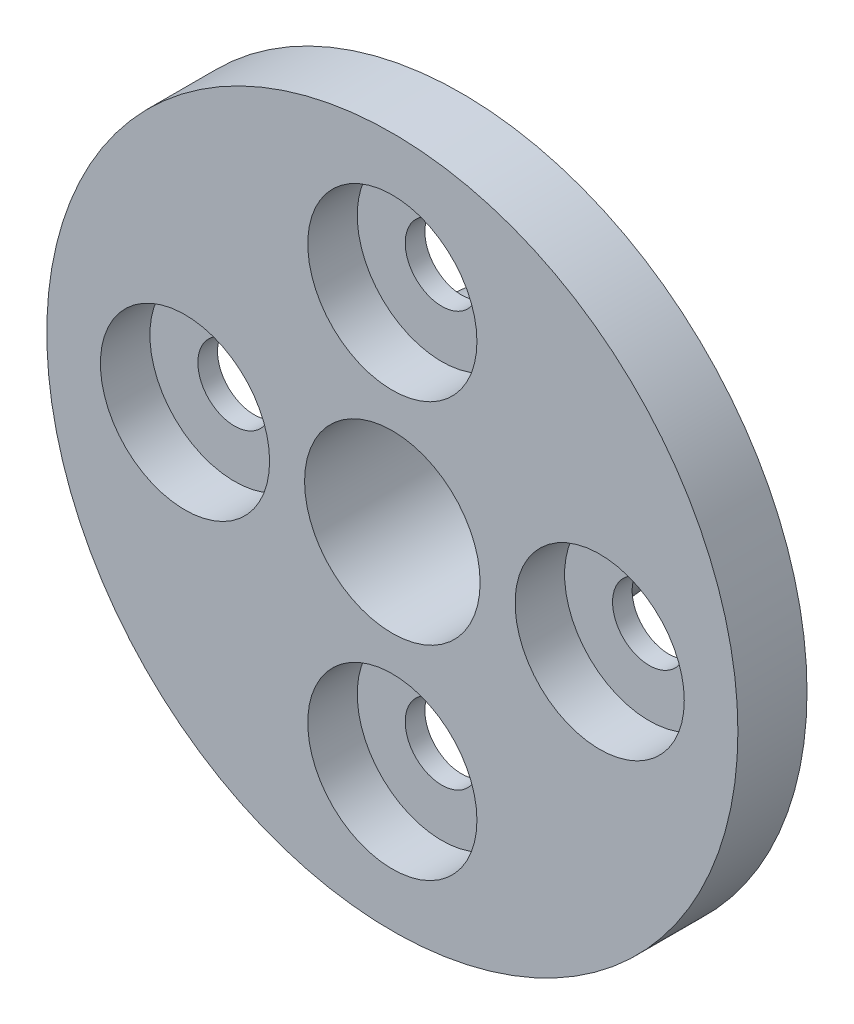
ISO-10303-21;
HEADER;
FILE_DESCRIPTION(('STEP AP214'),'2;1');
FILE_NAME('part.step','',(''),(''),'','','');
FILE_SCHEMA(('AUTOMOTIVE_DESIGN { 1 0 10303 214 1 1 1 1 }'));
ENDSEC;
DATA;
#1=APPLICATION_CONTEXT('core data for automotive mechanical design processes');
#2=APPLICATION_PROTOCOL_DEFINITION('international standard','automotive_design',2000,#1);
#3=PRODUCT_CONTEXT('',#1,'mechanical');
#4=PRODUCT('Part','Part','',(#3));
#5=PRODUCT_RELATED_PRODUCT_CATEGORY('part','',(#4));
#6=PRODUCT_DEFINITION_FORMATION('','',#4);
#7=PRODUCT_DEFINITION_CONTEXT('part definition',#1,'design');
#8=PRODUCT_DEFINITION('design','',#6,#7);
#9=PRODUCT_DEFINITION_SHAPE('','',#8);
#10=(LENGTH_UNIT() NAMED_UNIT(*) SI_UNIT(.MILLI.,.METRE.));
#11=(NAMED_UNIT(*) PLANE_ANGLE_UNIT() SI_UNIT($,.RADIAN.));
#12=(NAMED_UNIT(*) SI_UNIT($,.STERADIAN.) SOLID_ANGLE_UNIT());
#13=UNCERTAINTY_MEASURE_WITH_UNIT(LENGTH_MEASURE(1.E-05),#10,'distance_accuracy_value','');
#14=(GEOMETRIC_REPRESENTATION_CONTEXT(3) GLOBAL_UNCERTAINTY_ASSIGNED_CONTEXT((#13)) GLOBAL_UNIT_ASSIGNED_CONTEXT((#10,
#11,#12)) REPRESENTATION_CONTEXT('',''));
#15=CARTESIAN_POINT('',(0.,0.,0.));
#16=DIRECTION('',(0.,0.,1.));
#17=DIRECTION('',(1.,0.,0.));
#18=AXIS2_PLACEMENT_3D('',#15,#16,#17);
#19=CARTESIAN_POINT('',(0.,0.,0.));
#20=DIRECTION('',(0.,0.,1.));
#21=DIRECTION('',(1.,0.,0.));
#22=AXIS2_PLACEMENT_3D('',#19,#20,#21);
#23=PLANE('',#22);
#24=CARTESIAN_POINT('',(0.,15.,0.));
#25=DIRECTION('',(0.,0.,1.));
#26=DIRECTION('',(1.,0.,0.));
#27=AXIS2_PLACEMENT_3D('',#24,#25,#26);
#28=CIRCLE('',#27,2.65);
#29=CARTESIAN_POINT('',(2.65,15.,0.));
#30=VERTEX_POINT('',#29);
#31=EDGE_CURVE('E35',#30,#30,#28,.T.);
#32=ORIENTED_EDGE('',*,*,#31,.T.);
#33=EDGE_LOOP('',(#32));
#34=FACE_BOUND('',#33,.T.);
#35=CARTESIAN_POINT('',(15.,0.,0.));
#36=DIRECTION('',(0.,0.,1.));
#37=DIRECTION('',(1.,0.,0.));
#38=AXIS2_PLACEMENT_3D('',#35,#36,#37);
#39=CIRCLE('',#38,2.65);
#40=CARTESIAN_POINT('',(17.65,0.,0.));
#41=VERTEX_POINT('',#40);
#42=EDGE_CURVE('E57',#41,#41,#39,.T.);
#43=ORIENTED_EDGE('',*,*,#42,.T.);
#44=EDGE_LOOP('',(#43));
#45=FACE_BOUND('',#44,.T.);
#46=CARTESIAN_POINT('',(0.,-15.,0.));
#47=DIRECTION('',(0.,0.,1.));
#48=DIRECTION('',(1.,0.,0.));
#49=AXIS2_PLACEMENT_3D('',#46,#47,#48);
#50=CIRCLE('',#49,2.65);
#51=CARTESIAN_POINT('',(2.65,-15.,0.));
#52=VERTEX_POINT('',#51);
#53=EDGE_CURVE('E53',#52,#52,#50,.T.);
#54=ORIENTED_EDGE('',*,*,#53,.T.);
#55=EDGE_LOOP('',(#54));
#56=FACE_BOUND('',#55,.T.);
#57=CARTESIAN_POINT('',(-15.,0.,0.));
#58=DIRECTION('',(0.,0.,1.));
#59=DIRECTION('',(1.,0.,0.));
#60=AXIS2_PLACEMENT_3D('',#57,#58,#59);
#61=CIRCLE('',#60,2.65);
#62=CARTESIAN_POINT('',(-12.35,0.,0.));
#63=VERTEX_POINT('',#62);
#64=EDGE_CURVE('E48',#63,#63,#61,.T.);
#65=ORIENTED_EDGE('',*,*,#64,.T.);
#66=EDGE_LOOP('',(#65));
#67=FACE_BOUND('',#66,.T.);
#68=CARTESIAN_POINT('',(0.,0.,0.));
#69=DIRECTION('',(0.,0.,1.));
#70=DIRECTION('',(1.,0.,0.));
#71=AXIS2_PLACEMENT_3D('',#68,#69,#70);
#72=CIRCLE('',#71,25.);
#73=CARTESIAN_POINT('',(25.,0.,0.));
#74=VERTEX_POINT('',#73);
#75=EDGE_CURVE('E44',#74,#74,#72,.T.);
#76=ORIENTED_EDGE('',*,*,#75,.F.);
#77=EDGE_LOOP('',(#76));
#78=FACE_BOUND('',#77,.T.);
#79=CARTESIAN_POINT('',(0.,0.,0.));
#80=DIRECTION('',(0.,0.,1.));
#81=DIRECTION('',(1.,0.,0.));
#82=AXIS2_PLACEMENT_3D('',#79,#80,#81);
#83=CIRCLE('',#82,9.);
#84=CARTESIAN_POINT('',(9.,0.,0.));
#85=VERTEX_POINT('',#84);
#86=EDGE_CURVE('E10',#85,#85,#83,.F.);
#87=ORIENTED_EDGE('',*,*,#86,.F.);
#88=EDGE_LOOP('',(#87));
#89=FACE_BOUND('',#88,.T.);
#90=ADVANCED_FACE('F31',(#34,#45,#56,#67,#78,#89),#23,.F.);
#91=CARTESIAN_POINT('',(0.,0.,5.));
#92=DIRECTION('',(0.,0.,1.));
#93=DIRECTION('',(1.,0.,0.));
#94=AXIS2_PLACEMENT_3D('',#91,#92,#93);
#95=PLANE('',#94);
#96=CARTESIAN_POINT('',(0.,15.,5.));
#97=DIRECTION('',(0.,0.,1.));
#98=DIRECTION('',(1.,0.,0.));
#99=AXIS2_PLACEMENT_3D('',#96,#97,#98);
#100=CIRCLE('',#99,6.12);
#101=CARTESIAN_POINT('',(6.12,15.,5.));
#102=VERTEX_POINT('',#101);
#103=EDGE_CURVE('E176',#102,#102,#100,.T.);
#104=ORIENTED_EDGE('',*,*,#103,.F.);
#105=EDGE_LOOP('',(#104));
#106=FACE_BOUND('',#105,.T.);
#107=CARTESIAN_POINT('',(15.,0.,5.));
#108=DIRECTION('',(0.,0.,1.));
#109=DIRECTION('',(1.,0.,0.));
#110=AXIS2_PLACEMENT_3D('',#107,#108,#109);
#111=CIRCLE('',#110,6.12);
#112=CARTESIAN_POINT('',(21.12,0.,5.));
#113=VERTEX_POINT('',#112);
#114=EDGE_CURVE('E72',#113,#113,#111,.T.);
#115=ORIENTED_EDGE('',*,*,#114,.F.);
#116=EDGE_LOOP('',(#115));
#117=FACE_BOUND('',#116,.T.);
#118=CARTESIAN_POINT('',(0.,-15.,5.));
#119=DIRECTION('',(0.,0.,1.));
#120=DIRECTION('',(1.,0.,0.));
#121=AXIS2_PLACEMENT_3D('',#118,#119,#120);
#122=CIRCLE('',#121,6.12);
#123=CARTESIAN_POINT('',(6.12,-15.,5.));
#124=VERTEX_POINT('',#123);
#125=EDGE_CURVE('E59',#124,#124,#122,.T.);
#126=ORIENTED_EDGE('',*,*,#125,.F.);
#127=EDGE_LOOP('',(#126));
#128=FACE_BOUND('',#127,.T.);
#129=CARTESIAN_POINT('',(-15.,0.,5.));
#130=DIRECTION('',(0.,0.,1.));
#131=DIRECTION('',(1.,0.,0.));
#132=AXIS2_PLACEMENT_3D('',#129,#130,#131);
#133=CIRCLE('',#132,6.12);
#134=CARTESIAN_POINT('',(-8.88,0.,5.));
#135=VERTEX_POINT('',#134);
#136=EDGE_CURVE('E55',#135,#135,#133,.T.);
#137=ORIENTED_EDGE('',*,*,#136,.F.);
#138=EDGE_LOOP('',(#137));
#139=FACE_BOUND('',#138,.T.);
#140=CARTESIAN_POINT('',(0.,0.,5.));
#141=DIRECTION('',(0.,0.,1.));
#142=DIRECTION('',(1.,0.,0.));
#143=AXIS2_PLACEMENT_3D('',#140,#141,#142);
#144=CIRCLE('',#143,25.);
#145=CARTESIAN_POINT('',(25.,0.,5.));
#146=VERTEX_POINT('',#145);
#147=EDGE_CURVE('E39',#146,#146,#144,.T.);
#148=ORIENTED_EDGE('',*,*,#147,.T.);
#149=EDGE_LOOP('',(#148));
#150=FACE_BOUND('',#149,.T.);
#151=CARTESIAN_POINT('',(0.,0.,5.));
#152=DIRECTION('',(0.,0.,1.));
#153=DIRECTION('',(1.,0.,0.));
#154=AXIS2_PLACEMENT_3D('',#151,#152,#153);
#155=CIRCLE('',#154,6.35);
#156=CARTESIAN_POINT('',(6.35,0.,5.));
#157=VERTEX_POINT('',#156);
#158=EDGE_CURVE('E92',#157,#157,#155,.T.);
#159=ORIENTED_EDGE('',*,*,#158,.F.);
#160=EDGE_LOOP('',(#159));
#161=FACE_BOUND('',#160,.T.);
#162=ADVANCED_FACE('F102',(#106,#117,#128,#139,#150,#161),#95,.T.);
#163=CARTESIAN_POINT('',(0.,0.,5.));
#164=DIRECTION('',(0.,0.,-1.));
#165=DIRECTION('',(-1.,0.,0.));
#166=AXIS2_PLACEMENT_3D('',#163,#164,#165);
#167=CYLINDRICAL_SURFACE('',#166,25.);
#168=ORIENTED_EDGE('',*,*,#147,.F.);
#169=EDGE_LOOP('',(#168));
#170=FACE_BOUND('',#169,.T.);
#171=ORIENTED_EDGE('',*,*,#75,.T.);
#172=EDGE_LOOP('',(#171));
#173=FACE_BOUND('',#172,.T.);
#174=ADVANCED_FACE('F33',(#170,#173),#167,.T.);
#175=CARTESIAN_POINT('',(0.,0.,5.));
#176=DIRECTION('',(0.,0.,-1.));
#177=DIRECTION('',(-1.,0.,0.));
#178=AXIS2_PLACEMENT_3D('',#175,#176,#177);
#179=CYLINDRICAL_SURFACE('',#178,6.35);
#180=ORIENTED_EDGE('',*,*,#158,.T.);
#181=EDGE_LOOP('',(#180));
#182=FACE_BOUND('',#181,.T.);
#183=CARTESIAN_POINT('',(0.,0.,-6.));
#184=DIRECTION('',(0.,0.,-1.));
#185=DIRECTION('',(-1.,0.,0.));
#186=AXIS2_PLACEMENT_3D('',#183,#184,#185);
#187=CIRCLE('',#186,6.35);
#188=CARTESIAN_POINT('',(-6.35,0.,-6.));
#189=VERTEX_POINT('',#188);
#190=EDGE_CURVE('E51',#189,#189,#187,.T.);
#191=ORIENTED_EDGE('',*,*,#190,.T.);
#192=EDGE_LOOP('',(#191));
#193=FACE_BOUND('',#192,.T.);
#194=ADVANCED_FACE('F111',(#182,#193),#179,.F.);
#195=CARTESIAN_POINT('',(0.,0.,-6.));
#196=DIRECTION('',(0.,0.,-1.));
#197=DIRECTION('',(-1.,0.,0.));
#198=AXIS2_PLACEMENT_3D('',#195,#196,#197);
#199=PLANE('',#198);
#200=CARTESIAN_POINT('',(0.,0.,-6.));
#201=DIRECTION('',(0.,0.,-1.));
#202=DIRECTION('',(-1.,0.,0.));
#203=AXIS2_PLACEMENT_3D('',#200,#201,#202);
#204=CIRCLE('',#203,9.);
#205=CARTESIAN_POINT('',(-9.,0.,-6.));
#206=VERTEX_POINT('',#205);
#207=EDGE_CURVE('E89',#206,#206,#204,.T.);
#208=ORIENTED_EDGE('',*,*,#207,.T.);
#209=EDGE_LOOP('',(#208));
#210=FACE_BOUND('',#209,.T.);
#211=ORIENTED_EDGE('',*,*,#190,.F.);
#212=EDGE_LOOP('',(#211));
#213=FACE_BOUND('',#212,.T.);
#214=ADVANCED_FACE('F114',(#210,#213),#199,.T.);
#215=CARTESIAN_POINT('',(0.,0.,-6.));
#216=DIRECTION('',(0.,0.,1.));
#217=DIRECTION('',(1.,0.,0.));
#218=AXIS2_PLACEMENT_3D('',#215,#216,#217);
#219=CYLINDRICAL_SURFACE('',#218,9.);
#220=ORIENTED_EDGE('',*,*,#207,.F.);
#221=EDGE_LOOP('',(#220));
#222=FACE_BOUND('',#221,.T.);
#223=ORIENTED_EDGE('',*,*,#86,.T.);
#224=EDGE_LOOP('',(#223));
#225=FACE_BOUND('',#224,.T.);
#226=ADVANCED_FACE('F115',(#222,#225),#219,.T.);
#227=CARTESIAN_POINT('',(-15.,0.,5.));
#228=DIRECTION('',(0.,0.,1.));
#229=DIRECTION('',(1.,0.,0.));
#230=AXIS2_PLACEMENT_3D('',#227,#228,#229);
#231=CYLINDRICAL_SURFACE('',#230,2.65);
#232=CARTESIAN_POINT('',(-15.,0.,1.42));
#233=DIRECTION('',(0.,0.,1.));
#234=DIRECTION('',(1.,0.,0.));
#235=AXIS2_PLACEMENT_3D('',#232,#233,#234);
#236=CIRCLE('',#235,2.65);
#237=CARTESIAN_POINT('',(-12.35,0.,1.42));
#238=VERTEX_POINT('',#237);
#239=EDGE_CURVE('E52',#238,#238,#236,.T.);
#240=ORIENTED_EDGE('',*,*,#239,.T.);
#241=EDGE_LOOP('',(#240));
#242=FACE_BOUND('',#241,.T.);
#243=ORIENTED_EDGE('',*,*,#64,.F.);
#244=EDGE_LOOP('',(#243));
#245=FACE_BOUND('',#244,.T.);
#246=ADVANCED_FACE('F118',(#242,#245),#231,.F.);
#247=CARTESIAN_POINT('',(-12.35,0.,1.42));
#248=DIRECTION('',(0.,0.,-1.));
#249=DIRECTION('',(-1.,0.,0.));
#250=AXIS2_PLACEMENT_3D('',#247,#248,#249);
#251=PLANE('',#250);
#252=ORIENTED_EDGE('',*,*,#239,.F.);
#253=EDGE_LOOP('',(#252));
#254=FACE_BOUND('',#253,.T.);
#255=CARTESIAN_POINT('',(-15.,0.,1.42));
#256=DIRECTION('',(0.,0.,1.));
#257=DIRECTION('',(1.,0.,0.));
#258=AXIS2_PLACEMENT_3D('',#255,#256,#257);
#259=CIRCLE('',#258,6.12);
#260=CARTESIAN_POINT('',(-8.88,0.,1.42));
#261=VERTEX_POINT('',#260);
#262=EDGE_CURVE('E82',#261,#261,#259,.T.);
#263=ORIENTED_EDGE('',*,*,#262,.T.);
#264=EDGE_LOOP('',(#263));
#265=FACE_BOUND('',#264,.T.);
#266=ADVANCED_FACE('F125',(#254,#265),#251,.F.);
#267=CARTESIAN_POINT('',(-15.,0.,5.));
#268=DIRECTION('',(0.,0.,1.));
#269=DIRECTION('',(1.,0.,0.));
#270=AXIS2_PLACEMENT_3D('',#267,#268,#269);
#271=CYLINDRICAL_SURFACE('',#270,6.12);
#272=ORIENTED_EDGE('',*,*,#262,.F.);
#273=EDGE_LOOP('',(#272));
#274=FACE_BOUND('',#273,.T.);
#275=ORIENTED_EDGE('',*,*,#136,.T.);
#276=EDGE_LOOP('',(#275));
#277=FACE_BOUND('',#276,.T.);
#278=ADVANCED_FACE('F129',(#274,#277),#271,.F.);
#279=CARTESIAN_POINT('',(0.,-15.,5.));
#280=DIRECTION('',(0.,0.,1.));
#281=DIRECTION('',(1.,0.,0.));
#282=AXIS2_PLACEMENT_3D('',#279,#280,#281);
#283=CYLINDRICAL_SURFACE('',#282,2.65);
#284=CARTESIAN_POINT('',(0.,-15.,1.42));
#285=DIRECTION('',(0.,0.,1.));
#286=DIRECTION('',(1.,0.,0.));
#287=AXIS2_PLACEMENT_3D('',#284,#285,#286);
#288=CIRCLE('',#287,2.65);
#289=CARTESIAN_POINT('',(2.65,-15.,1.42));
#290=VERTEX_POINT('',#289);
#291=EDGE_CURVE('E56',#290,#290,#288,.T.);
#292=ORIENTED_EDGE('',*,*,#291,.T.);
#293=EDGE_LOOP('',(#292));
#294=FACE_BOUND('',#293,.T.);
#295=ORIENTED_EDGE('',*,*,#53,.F.);
#296=EDGE_LOOP('',(#295));
#297=FACE_BOUND('',#296,.T.);
#298=ADVANCED_FACE('F133',(#294,#297),#283,.F.);
#299=CARTESIAN_POINT('',(2.65,-15.,1.42));
#300=DIRECTION('',(0.,0.,-1.));
#301=DIRECTION('',(-1.,0.,0.));
#302=AXIS2_PLACEMENT_3D('',#299,#300,#301);
#303=PLANE('',#302);
#304=ORIENTED_EDGE('',*,*,#291,.F.);
#305=EDGE_LOOP('',(#304));
#306=FACE_BOUND('',#305,.T.);
#307=CARTESIAN_POINT('',(0.,-15.,1.42));
#308=DIRECTION('',(0.,0.,1.));
#309=DIRECTION('',(1.,0.,0.));
#310=AXIS2_PLACEMENT_3D('',#307,#308,#309);
#311=CIRCLE('',#310,6.12);
#312=CARTESIAN_POINT('',(6.12,-15.,1.42));
#313=VERTEX_POINT('',#312);
#314=EDGE_CURVE('E64',#313,#313,#311,.T.);
#315=ORIENTED_EDGE('',*,*,#314,.T.);
#316=EDGE_LOOP('',(#315));
#317=FACE_BOUND('',#316,.T.);
#318=ADVANCED_FACE('F137',(#306,#317),#303,.F.);
#319=CARTESIAN_POINT('',(0.,-15.,5.));
#320=DIRECTION('',(0.,0.,1.));
#321=DIRECTION('',(1.,0.,0.));
#322=AXIS2_PLACEMENT_3D('',#319,#320,#321);
#323=CYLINDRICAL_SURFACE('',#322,6.12);
#324=ORIENTED_EDGE('',*,*,#314,.F.);
#325=EDGE_LOOP('',(#324));
#326=FACE_BOUND('',#325,.T.);
#327=ORIENTED_EDGE('',*,*,#125,.T.);
#328=EDGE_LOOP('',(#327));
#329=FACE_BOUND('',#328,.T.);
#330=ADVANCED_FACE('F141',(#326,#329),#323,.F.);
#331=CARTESIAN_POINT('',(15.,0.,5.));
#332=DIRECTION('',(0.,0.,1.));
#333=DIRECTION('',(1.,0.,0.));
#334=AXIS2_PLACEMENT_3D('',#331,#332,#333);
#335=CYLINDRICAL_SURFACE('',#334,2.65);
#336=CARTESIAN_POINT('',(15.,0.,1.42));
#337=DIRECTION('',(0.,0.,1.));
#338=DIRECTION('',(1.,0.,0.));
#339=AXIS2_PLACEMENT_3D('',#336,#337,#338);
#340=CIRCLE('',#339,2.65);
#341=CARTESIAN_POINT('',(17.65,0.,1.42));
#342=VERTEX_POINT('',#341);
#343=EDGE_CURVE('E60',#342,#342,#340,.T.);
#344=ORIENTED_EDGE('',*,*,#343,.T.);
#345=EDGE_LOOP('',(#344));
#346=FACE_BOUND('',#345,.T.);
#347=ORIENTED_EDGE('',*,*,#42,.F.);
#348=EDGE_LOOP('',(#347));
#349=FACE_BOUND('',#348,.T.);
#350=ADVANCED_FACE('F145',(#346,#349),#335,.F.);
#351=CARTESIAN_POINT('',(17.65,0.,1.42));
#352=DIRECTION('',(0.,0.,-1.));
#353=DIRECTION('',(-1.,0.,0.));
#354=AXIS2_PLACEMENT_3D('',#351,#352,#353);
#355=PLANE('',#354);
#356=ORIENTED_EDGE('',*,*,#343,.F.);
#357=EDGE_LOOP('',(#356));
#358=FACE_BOUND('',#357,.T.);
#359=CARTESIAN_POINT('',(15.,0.,1.42));
#360=DIRECTION('',(0.,0.,1.));
#361=DIRECTION('',(1.,0.,0.));
#362=AXIS2_PLACEMENT_3D('',#359,#360,#361);
#363=CIRCLE('',#362,6.12);
#364=CARTESIAN_POINT('',(21.12,0.,1.42));
#365=VERTEX_POINT('',#364);
#366=EDGE_CURVE('E67',#365,#365,#363,.T.);
#367=ORIENTED_EDGE('',*,*,#366,.T.);
#368=EDGE_LOOP('',(#367));
#369=FACE_BOUND('',#368,.T.);
#370=ADVANCED_FACE('F149',(#358,#369),#355,.F.);
#371=CARTESIAN_POINT('',(15.,0.,5.));
#372=DIRECTION('',(0.,0.,1.));
#373=DIRECTION('',(1.,0.,0.));
#374=AXIS2_PLACEMENT_3D('',#371,#372,#373);
#375=CYLINDRICAL_SURFACE('',#374,6.12);
#376=ORIENTED_EDGE('',*,*,#366,.F.);
#377=EDGE_LOOP('',(#376));
#378=FACE_BOUND('',#377,.T.);
#379=ORIENTED_EDGE('',*,*,#114,.T.);
#380=EDGE_LOOP('',(#379));
#381=FACE_BOUND('',#380,.T.);
#382=ADVANCED_FACE('F152',(#378,#381),#375,.F.);
#383=CARTESIAN_POINT('',(0.,15.,5.));
#384=DIRECTION('',(0.,0.,1.));
#385=DIRECTION('',(1.,0.,0.));
#386=AXIS2_PLACEMENT_3D('',#383,#384,#385);
#387=CYLINDRICAL_SURFACE('',#386,2.65);
#388=CARTESIAN_POINT('',(0.,15.,1.42));
#389=DIRECTION('',(0.,0.,1.));
#390=DIRECTION('',(1.,0.,0.));
#391=AXIS2_PLACEMENT_3D('',#388,#389,#390);
#392=CIRCLE('',#391,2.65);
#393=CARTESIAN_POINT('',(2.65,15.,1.42));
#394=VERTEX_POINT('',#393);
#395=EDGE_CURVE('E178',#394,#394,#392,.T.);
#396=ORIENTED_EDGE('',*,*,#395,.T.);
#397=EDGE_LOOP('',(#396));
#398=FACE_BOUND('',#397,.T.);
#399=ORIENTED_EDGE('',*,*,#31,.F.);
#400=EDGE_LOOP('',(#399));
#401=FACE_BOUND('',#400,.T.);
#402=ADVANCED_FACE('F156',(#398,#401),#387,.F.);
#403=CARTESIAN_POINT('',(2.65,15.,1.42));
#404=DIRECTION('',(0.,0.,-1.));
#405=DIRECTION('',(-1.,0.,0.));
#406=AXIS2_PLACEMENT_3D('',#403,#404,#405);
#407=PLANE('',#406);
#408=ORIENTED_EDGE('',*,*,#395,.F.);
#409=EDGE_LOOP('',(#408));
#410=FACE_BOUND('',#409,.T.);
#411=CARTESIAN_POINT('',(0.,15.,1.42));
#412=DIRECTION('',(0.,0.,1.));
#413=DIRECTION('',(1.,0.,0.));
#414=AXIS2_PLACEMENT_3D('',#411,#412,#413);
#415=CIRCLE('',#414,6.12);
#416=CARTESIAN_POINT('',(6.12,15.,1.42));
#417=VERTEX_POINT('',#416);
#418=EDGE_CURVE('E173',#417,#417,#415,.T.);
#419=ORIENTED_EDGE('',*,*,#418,.T.);
#420=EDGE_LOOP('',(#419));
#421=FACE_BOUND('',#420,.T.);
#422=ADVANCED_FACE('F160',(#410,#421),#407,.F.);
#423=CARTESIAN_POINT('',(0.,15.,5.));
#424=DIRECTION('',(0.,0.,1.));
#425=DIRECTION('',(1.,0.,0.));
#426=AXIS2_PLACEMENT_3D('',#423,#424,#425);
#427=CYLINDRICAL_SURFACE('',#426,6.12);
#428=ORIENTED_EDGE('',*,*,#418,.F.);
#429=EDGE_LOOP('',(#428));
#430=FACE_BOUND('',#429,.T.);
#431=ORIENTED_EDGE('',*,*,#103,.T.);
#432=EDGE_LOOP('',(#431));
#433=FACE_BOUND('',#432,.T.);
#434=ADVANCED_FACE('F164',(#430,#433),#427,.F.);
#435=CLOSED_SHELL('',(#90,#162,#174,#194,#214,#226,#246,#266,#278,#298,#318,#330,#350,#370,#382,
#402,#422,#434));
#436=MANIFOLD_SOLID_BREP('B2',#435);
#437=ADVANCED_BREP_SHAPE_REPRESENTATION('',(#18,#436),#14);
#438=SHAPE_DEFINITION_REPRESENTATION(#9,#437);
ENDSEC;
END-ISO-10303-21;
